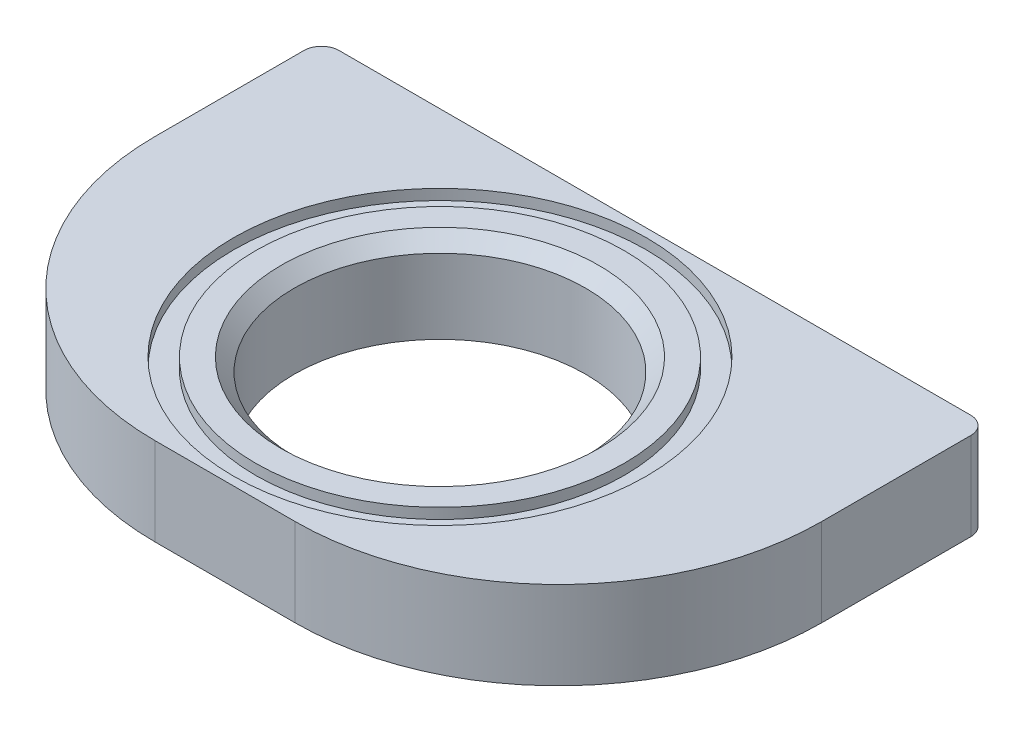
ISO-10303-21;
HEADER;
FILE_DESCRIPTION(('STEP AP214'),'2;1');
FILE_NAME('part.step','',(''),(''),'','','');
FILE_SCHEMA(('AUTOMOTIVE_DESIGN { 1 0 10303 214 1 1 1 1 }'));
ENDSEC;
DATA;
#1=APPLICATION_CONTEXT('core data for automotive mechanical design processes');
#2=APPLICATION_PROTOCOL_DEFINITION('international standard','automotive_design',2000,#1);
#3=PRODUCT_CONTEXT('',#1,'mechanical');
#4=PRODUCT('Part','Part','',(#3));
#5=PRODUCT_RELATED_PRODUCT_CATEGORY('part','',(#4));
#6=PRODUCT_DEFINITION_FORMATION('','',#4);
#7=PRODUCT_DEFINITION_CONTEXT('part definition',#1,'design');
#8=PRODUCT_DEFINITION('design','',#6,#7);
#9=PRODUCT_DEFINITION_SHAPE('','',#8);
#10=(LENGTH_UNIT() NAMED_UNIT(*) SI_UNIT(.MILLI.,.METRE.));
#11=(NAMED_UNIT(*) PLANE_ANGLE_UNIT() SI_UNIT($,.RADIAN.));
#12=(NAMED_UNIT(*) SI_UNIT($,.STERADIAN.) SOLID_ANGLE_UNIT());
#13=UNCERTAINTY_MEASURE_WITH_UNIT(LENGTH_MEASURE(1.E-05),#10,'distance_accuracy_value','');
#14=(GEOMETRIC_REPRESENTATION_CONTEXT(3) GLOBAL_UNCERTAINTY_ASSIGNED_CONTEXT((#13)) GLOBAL_UNIT_ASSIGNED_CONTEXT((#10,
#11,#12)) REPRESENTATION_CONTEXT('',''));
#15=CARTESIAN_POINT('',(0.,0.,0.));
#16=DIRECTION('',(0.,0.,1.));
#17=DIRECTION('',(1.,0.,0.));
#18=AXIS2_PLACEMENT_3D('',#15,#16,#17);
#19=CARTESIAN_POINT('',(0.,5.,0.));
#20=DIRECTION('',(0.,1.,0.));
#21=DIRECTION('',(0.,0.,1.));
#22=AXIS2_PLACEMENT_3D('',#19,#20,#21);
#23=PLANE('',#22);
#24=CARTESIAN_POINT('',(0.,5.,0.));
#25=DIRECTION('',(0.,1.,0.));
#26=DIRECTION('',(0.,0.,1.));
#27=AXIS2_PLACEMENT_3D('',#24,#25,#26);
#28=CIRCLE('',#27,10.5);
#29=CARTESIAN_POINT('',(-10.5,5.,0.));
#30=VERTEX_POINT('',#29);
#31=EDGE_CURVE('E11',#30,#30,#28,.F.);
#32=ORIENTED_EDGE('',*,*,#31,.F.);
#33=EDGE_LOOP('',(#32));
#34=FACE_BOUND('',#33,.T.);
#35=CARTESIAN_POINT('',(0.,5.,0.));
#36=DIRECTION('',(0.,1.,0.));
#37=DIRECTION('',(0.,0.,1.));
#38=AXIS2_PLACEMENT_3D('',#35,#36,#37);
#39=CIRCLE('',#38,9.05000000000001);
#40=CARTESIAN_POINT('',(0.,5.,9.05000000000001));
#41=VERTEX_POINT('',#40);
#42=EDGE_CURVE('E195',#41,#41,#39,.F.);
#43=ORIENTED_EDGE('',*,*,#42,.T.);
#44=EDGE_LOOP('',(#43));
#45=FACE_BOUND('',#44,.T.);
#46=ADVANCED_FACE('F38',(#34,#45),#23,.T.);
#47=CARTESIAN_POINT('',(0.,5.,0.));
#48=DIRECTION('',(0.,1.,0.));
#49=DIRECTION('',(0.,0.,1.));
#50=AXIS2_PLACEMENT_3D('',#47,#48,#49);
#51=CIRCLE('',#50,11.7670948647706);
#52=CARTESIAN_POINT('',(-11.7670948647706,5.,0.));
#53=VERTEX_POINT('',#52);
#54=EDGE_CURVE('E47',#53,#53,#51,.T.);
#55=ORIENTED_EDGE('',*,*,#54,.F.);
#56=EDGE_LOOP('',(#55));
#57=FACE_BOUND('',#56,.T.);
#58=DIRECTION('',(-1.,0.,0.));
#59=VECTOR('',#58,1.);
#60=CARTESIAN_POINT('',(-19.,5.,-12.25));
#61=LINE('',#60,#59);
#62=CARTESIAN_POINT('',(18.,5.,-12.25));
#63=VERTEX_POINT('',#62);
#64=CARTESIAN_POINT('',(-18.,5.,-12.25));
#65=VERTEX_POINT('',#64);
#66=EDGE_CURVE('E142',#63,#65,#61,.T.);
#67=ORIENTED_EDGE('',*,*,#66,.T.);
#68=CARTESIAN_POINT('',(-18.,5.,-11.25));
#69=DIRECTION('',(0.,1.,0.));
#70=DIRECTION('',(0.,0.,1.));
#71=AXIS2_PLACEMENT_3D('',#68,#69,#70);
#72=CIRCLE('',#71,1.);
#73=CARTESIAN_POINT('',(-19.,5.,-11.25));
#74=VERTEX_POINT('',#73);
#75=EDGE_CURVE('E188',#65,#74,#72,.T.);
#76=ORIENTED_EDGE('',*,*,#75,.T.);
#77=DIRECTION('',(0.,0.,1.));
#78=VECTOR('',#77,1.);
#79=CARTESIAN_POINT('',(-19.,5.,-12.25));
#80=LINE('',#79,#78);
#81=CARTESIAN_POINT('',(-19.,5.,-2.75));
#82=VERTEX_POINT('',#81);
#83=EDGE_CURVE('E133',#74,#82,#80,.T.);
#84=ORIENTED_EDGE('',*,*,#83,.T.);
#85=CARTESIAN_POINT('',(-4.,5.,-2.75));
#86=DIRECTION('',(0.,1.,0.));
#87=DIRECTION('',(0.,0.,1.));
#88=AXIS2_PLACEMENT_3D('',#85,#86,#87);
#89=CIRCLE('',#88,15.);
#90=CARTESIAN_POINT('',(-4.,5.,12.25));
#91=VERTEX_POINT('',#90);
#92=EDGE_CURVE('E167',#82,#91,#89,.T.);
#93=ORIENTED_EDGE('',*,*,#92,.T.);
#94=DIRECTION('',(1.,0.,0.));
#95=VECTOR('',#94,1.);
#96=CARTESIAN_POINT('',(-19.,5.,12.25));
#97=LINE('',#96,#95);
#98=CARTESIAN_POINT('',(4.,5.,12.25));
#99=VERTEX_POINT('',#98);
#100=EDGE_CURVE('E135',#91,#99,#97,.T.);
#101=ORIENTED_EDGE('',*,*,#100,.T.);
#102=CARTESIAN_POINT('',(4.,5.,-2.75));
#103=DIRECTION('',(0.,1.,0.));
#104=DIRECTION('',(0.,0.,1.));
#105=AXIS2_PLACEMENT_3D('',#102,#103,#104);
#106=CIRCLE('',#105,15.);
#107=CARTESIAN_POINT('',(19.,5.,-2.75));
#108=VERTEX_POINT('',#107);
#109=EDGE_CURVE('E169',#99,#108,#106,.T.);
#110=ORIENTED_EDGE('',*,*,#109,.T.);
#111=DIRECTION('',(0.,0.,-1.));
#112=VECTOR('',#111,1.);
#113=CARTESIAN_POINT('',(19.,5.,-12.25));
#114=LINE('',#113,#112);
#115=CARTESIAN_POINT('',(19.,5.,-11.25));
#116=VERTEX_POINT('',#115);
#117=EDGE_CURVE('E139',#108,#116,#114,.T.);
#118=ORIENTED_EDGE('',*,*,#117,.T.);
#119=CARTESIAN_POINT('',(18.,5.,-11.25));
#120=DIRECTION('',(0.,1.,0.));
#121=DIRECTION('',(0.,0.,1.));
#122=AXIS2_PLACEMENT_3D('',#119,#120,#121);
#123=CIRCLE('',#122,1.);
#124=EDGE_CURVE('E186',#116,#63,#123,.T.);
#125=ORIENTED_EDGE('',*,*,#124,.T.);
#126=EDGE_LOOP('',(#67,#76,#84,#93,#101,#110,#118,#125));
#127=FACE_BOUND('',#126,.T.);
#128=ADVANCED_FACE('F217',(#57,#127),#23,.T.);
#129=CARTESIAN_POINT('',(0.,0.,0.));
#130=DIRECTION('',(0.,1.,0.));
#131=DIRECTION('',(0.,0.,1.));
#132=AXIS2_PLACEMENT_3D('',#129,#130,#131);
#133=PLANE('',#132);
#134=DIRECTION('',(0.,0.,1.));
#135=VECTOR('',#134,1.);
#136=CARTESIAN_POINT('',(-19.,0.,-12.25));
#137=LINE('',#136,#135);
#138=CARTESIAN_POINT('',(-19.,0.,-11.25));
#139=VERTEX_POINT('',#138);
#140=CARTESIAN_POINT('',(-19.,0.,-2.75));
#141=VERTEX_POINT('',#140);
#142=EDGE_CURVE('E132',#139,#141,#137,.T.);
#143=ORIENTED_EDGE('',*,*,#142,.F.);
#144=CARTESIAN_POINT('',(-18.,0.,-11.25));
#145=DIRECTION('',(0.,1.,0.));
#146=DIRECTION('',(0.,0.,1.));
#147=AXIS2_PLACEMENT_3D('',#144,#145,#146);
#148=CIRCLE('',#147,1.);
#149=CARTESIAN_POINT('',(-18.,0.,-12.25));
#150=VERTEX_POINT('',#149);
#151=EDGE_CURVE('E179',#139,#150,#148,.F.);
#152=ORIENTED_EDGE('',*,*,#151,.T.);
#153=DIRECTION('',(-1.,0.,0.));
#154=VECTOR('',#153,1.);
#155=CARTESIAN_POINT('',(-19.,0.,-12.25));
#156=LINE('',#155,#154);
#157=CARTESIAN_POINT('',(18.,0.,-12.25));
#158=VERTEX_POINT('',#157);
#159=EDGE_CURVE('E136',#158,#150,#156,.T.);
#160=ORIENTED_EDGE('',*,*,#159,.F.);
#161=CARTESIAN_POINT('',(18.,0.,-11.25));
#162=DIRECTION('',(0.,1.,0.));
#163=DIRECTION('',(0.,0.,1.));
#164=AXIS2_PLACEMENT_3D('',#161,#162,#163);
#165=CIRCLE('',#164,1.);
#166=CARTESIAN_POINT('',(19.,0.,-11.25));
#167=VERTEX_POINT('',#166);
#168=EDGE_CURVE('E177',#158,#167,#165,.F.);
#169=ORIENTED_EDGE('',*,*,#168,.T.);
#170=DIRECTION('',(0.,0.,-1.));
#171=VECTOR('',#170,1.);
#172=CARTESIAN_POINT('',(19.,0.,-12.25));
#173=LINE('',#172,#171);
#174=CARTESIAN_POINT('',(19.,0.,-2.75));
#175=VERTEX_POINT('',#174);
#176=EDGE_CURVE('E150',#175,#167,#173,.T.);
#177=ORIENTED_EDGE('',*,*,#176,.F.);
#178=CARTESIAN_POINT('',(4.,0.,-2.75));
#179=DIRECTION('',(0.,1.,0.));
#180=DIRECTION('',(0.,0.,1.));
#181=AXIS2_PLACEMENT_3D('',#178,#179,#180);
#182=CIRCLE('',#181,15.);
#183=CARTESIAN_POINT('',(4.,0.,12.25));
#184=VERTEX_POINT('',#183);
#185=EDGE_CURVE('E160',#175,#184,#182,.F.);
#186=ORIENTED_EDGE('',*,*,#185,.T.);
#187=DIRECTION('',(1.,0.,0.));
#188=VECTOR('',#187,1.);
#189=CARTESIAN_POINT('',(-19.,0.,12.25));
#190=LINE('',#189,#188);
#191=CARTESIAN_POINT('',(-4.,0.,12.25));
#192=VERTEX_POINT('',#191);
#193=EDGE_CURVE('E147',#192,#184,#190,.T.);
#194=ORIENTED_EDGE('',*,*,#193,.F.);
#195=CARTESIAN_POINT('',(-4.,0.,-2.75));
#196=DIRECTION('',(0.,1.,0.));
#197=DIRECTION('',(0.,0.,1.));
#198=AXIS2_PLACEMENT_3D('',#195,#196,#197);
#199=CIRCLE('',#198,15.);
#200=EDGE_CURVE('E157',#192,#141,#199,.F.);
#201=ORIENTED_EDGE('',*,*,#200,.T.);
#202=EDGE_LOOP('',(#143,#152,#160,#169,#177,#186,#194,#201));
#203=FACE_BOUND('',#202,.T.);
#204=CARTESIAN_POINT('',(0.,0.,0.));
#205=DIRECTION('',(0.,1.,0.));
#206=DIRECTION('',(0.,0.,1.));
#207=AXIS2_PLACEMENT_3D('',#204,#205,#206);
#208=CIRCLE('',#207,8.3);
#209=CARTESIAN_POINT('',(0.,0.,8.3));
#210=VERTEX_POINT('',#209);
#211=EDGE_CURVE('E125',#210,#210,#208,.T.);
#212=ORIENTED_EDGE('',*,*,#211,.T.);
#213=EDGE_LOOP('',(#212));
#214=FACE_BOUND('',#213,.T.);
#215=ADVANCED_FACE('F214',(#203,#214),#133,.F.);
#216=CARTESIAN_POINT('',(-19.,5.,-12.25));
#217=DIRECTION('',(1.,0.,0.));
#218=DIRECTION('',(0.,0.,-1.));
#219=AXIS2_PLACEMENT_3D('',#216,#217,#218);
#220=PLANE('',#219);
#221=ORIENTED_EDGE('',*,*,#83,.F.);
#222=DIRECTION('',(0.,-1.,0.));
#223=VECTOR('',#222,1.);
#224=CARTESIAN_POINT('',(-19.,5.,-11.25));
#225=LINE('',#224,#223);
#226=EDGE_CURVE('E174',#74,#139,#225,.T.);
#227=ORIENTED_EDGE('',*,*,#226,.T.);
#228=ORIENTED_EDGE('',*,*,#142,.T.);
#229=DIRECTION('',(0.,-1.,0.));
#230=VECTOR('',#229,1.);
#231=CARTESIAN_POINT('',(-19.,5.,-2.75));
#232=LINE('',#231,#230);
#233=EDGE_CURVE('E171',#141,#82,#232,.F.);
#234=ORIENTED_EDGE('',*,*,#233,.T.);
#235=EDGE_LOOP('',(#221,#227,#228,#234));
#236=FACE_BOUND('',#235,.T.);
#237=ADVANCED_FACE('F216',(#236),#220,.F.);
#238=CARTESIAN_POINT('',(-19.,5.,12.25));
#239=DIRECTION('',(0.,0.,-1.));
#240=DIRECTION('',(-1.,0.,0.));
#241=AXIS2_PLACEMENT_3D('',#238,#239,#240);
#242=PLANE('',#241);
#243=ORIENTED_EDGE('',*,*,#193,.T.);
#244=DIRECTION('',(0.,-1.,0.));
#245=VECTOR('',#244,1.);
#246=CARTESIAN_POINT('',(4.,5.,12.25));
#247=LINE('',#246,#245);
#248=EDGE_CURVE('E165',#184,#99,#247,.F.);
#249=ORIENTED_EDGE('',*,*,#248,.T.);
#250=ORIENTED_EDGE('',*,*,#100,.F.);
#251=DIRECTION('',(0.,-1.,0.));
#252=VECTOR('',#251,1.);
#253=CARTESIAN_POINT('',(-4.,5.,12.25));
#254=LINE('',#253,#252);
#255=EDGE_CURVE('E162',#91,#192,#254,.T.);
#256=ORIENTED_EDGE('',*,*,#255,.T.);
#257=EDGE_LOOP('',(#243,#249,#250,#256));
#258=FACE_BOUND('',#257,.T.);
#259=ADVANCED_FACE('F224',(#258),#242,.F.);
#260=CARTESIAN_POINT('',(19.,5.,-12.25));
#261=DIRECTION('',(-1.,0.,0.));
#262=DIRECTION('',(0.,0.,1.));
#263=AXIS2_PLACEMENT_3D('',#260,#261,#262);
#264=PLANE('',#263);
#265=ORIENTED_EDGE('',*,*,#176,.T.);
#266=DIRECTION('',(0.,-1.,0.));
#267=VECTOR('',#266,1.);
#268=CARTESIAN_POINT('',(19.,5.,-11.25));
#269=LINE('',#268,#267);
#270=EDGE_CURVE('E190',#167,#116,#269,.F.);
#271=ORIENTED_EDGE('',*,*,#270,.T.);
#272=ORIENTED_EDGE('',*,*,#117,.F.);
#273=DIRECTION('',(0.,-1.,0.));
#274=VECTOR('',#273,1.);
#275=CARTESIAN_POINT('',(19.,5.,-2.75));
#276=LINE('',#275,#274);
#277=EDGE_CURVE('E145',#108,#175,#276,.T.);
#278=ORIENTED_EDGE('',*,*,#277,.T.);
#279=EDGE_LOOP('',(#265,#271,#272,#278));
#280=FACE_BOUND('',#279,.T.);
#281=ADVANCED_FACE('F297',(#280),#264,.F.);
#282=CARTESIAN_POINT('',(-19.,5.,-12.25));
#283=DIRECTION('',(0.,0.,1.));
#284=DIRECTION('',(1.,0.,0.));
#285=AXIS2_PLACEMENT_3D('',#282,#283,#284);
#286=PLANE('',#285);
#287=ORIENTED_EDGE('',*,*,#159,.T.);
#288=DIRECTION('',(0.,-1.,0.));
#289=VECTOR('',#288,1.);
#290=CARTESIAN_POINT('',(-18.,5.,-12.25));
#291=LINE('',#290,#289);
#292=EDGE_CURVE('E184',#150,#65,#291,.F.);
#293=ORIENTED_EDGE('',*,*,#292,.T.);
#294=ORIENTED_EDGE('',*,*,#66,.F.);
#295=DIRECTION('',(0.,-1.,0.));
#296=VECTOR('',#295,1.);
#297=CARTESIAN_POINT('',(18.,5.,-12.25));
#298=LINE('',#297,#296);
#299=EDGE_CURVE('E181',#63,#158,#298,.T.);
#300=ORIENTED_EDGE('',*,*,#299,.T.);
#301=EDGE_LOOP('',(#287,#293,#294,#300));
#302=FACE_BOUND('',#301,.T.);
#303=ADVANCED_FACE('F210',(#302),#286,.F.);
#304=CARTESIAN_POINT('',(0.,5.,0.));
#305=DIRECTION('',(0.,-1.,0.));
#306=DIRECTION('',(0.,0.,-1.));
#307=AXIS2_PLACEMENT_3D('',#304,#305,#306);
#308=CYLINDRICAL_SURFACE('',#307,8.3);
#309=CARTESIAN_POINT('',(0.,4.25,0.));
#310=DIRECTION('',(0.,1.,0.));
#311=DIRECTION('',(0.,0.,1.));
#312=AXIS2_PLACEMENT_3D('',#309,#310,#311);
#313=CIRCLE('',#312,8.3);
#314=CARTESIAN_POINT('',(0.,4.25,8.3));
#315=VERTEX_POINT('',#314);
#316=EDGE_CURVE('E192',#315,#315,#313,.T.);
#317=ORIENTED_EDGE('',*,*,#316,.T.);
#318=EDGE_LOOP('',(#317));
#319=FACE_BOUND('',#318,.T.);
#320=ORIENTED_EDGE('',*,*,#211,.F.);
#321=EDGE_LOOP('',(#320));
#322=FACE_BOUND('',#321,.T.);
#323=ADVANCED_FACE('F206',(#319,#322),#308,.F.);
#324=CARTESIAN_POINT('',(4.,5.,-2.75));
#325=DIRECTION('',(0.,-1.,0.));
#326=DIRECTION('',(0.,0.,-1.));
#327=AXIS2_PLACEMENT_3D('',#324,#325,#326);
#328=CYLINDRICAL_SURFACE('',#327,15.);
#329=ORIENTED_EDGE('',*,*,#109,.F.);
#330=ORIENTED_EDGE('',*,*,#248,.F.);
#331=ORIENTED_EDGE('',*,*,#185,.F.);
#332=ORIENTED_EDGE('',*,*,#277,.F.);
#333=EDGE_LOOP('',(#329,#330,#331,#332));
#334=FACE_BOUND('',#333,.T.);
#335=ADVANCED_FACE('F209',(#334),#328,.T.);
#336=CARTESIAN_POINT('',(-4.,5.,-2.75));
#337=DIRECTION('',(0.,-1.,0.));
#338=DIRECTION('',(0.,0.,-1.));
#339=AXIS2_PLACEMENT_3D('',#336,#337,#338);
#340=CYLINDRICAL_SURFACE('',#339,15.);
#341=ORIENTED_EDGE('',*,*,#92,.F.);
#342=ORIENTED_EDGE('',*,*,#233,.F.);
#343=ORIENTED_EDGE('',*,*,#200,.F.);
#344=ORIENTED_EDGE('',*,*,#255,.F.);
#345=EDGE_LOOP('',(#341,#342,#343,#344));
#346=FACE_BOUND('',#345,.T.);
#347=ADVANCED_FACE('F271',(#346),#340,.T.);
#348=CARTESIAN_POINT('',(-18.,5.,-11.25));
#349=DIRECTION('',(0.,-1.,0.));
#350=DIRECTION('',(0.,0.,-1.));
#351=AXIS2_PLACEMENT_3D('',#348,#349,#350);
#352=CYLINDRICAL_SURFACE('',#351,1.);
#353=ORIENTED_EDGE('',*,*,#75,.F.);
#354=ORIENTED_EDGE('',*,*,#292,.F.);
#355=ORIENTED_EDGE('',*,*,#151,.F.);
#356=ORIENTED_EDGE('',*,*,#226,.F.);
#357=EDGE_LOOP('',(#353,#354,#355,#356));
#358=FACE_BOUND('',#357,.T.);
#359=ADVANCED_FACE('F264',(#358),#352,.T.);
#360=CARTESIAN_POINT('',(18.,5.,-11.25));
#361=DIRECTION('',(0.,-1.,0.));
#362=DIRECTION('',(0.,0.,-1.));
#363=AXIS2_PLACEMENT_3D('',#360,#361,#362);
#364=CYLINDRICAL_SURFACE('',#363,1.);
#365=ORIENTED_EDGE('',*,*,#124,.F.);
#366=ORIENTED_EDGE('',*,*,#270,.F.);
#367=ORIENTED_EDGE('',*,*,#168,.F.);
#368=ORIENTED_EDGE('',*,*,#299,.F.);
#369=EDGE_LOOP('',(#365,#366,#367,#368));
#370=FACE_BOUND('',#369,.T.);
#371=ADVANCED_FACE('F203',(#370),#364,.T.);
#372=CARTESIAN_POINT('',(0.,4.25,0.));
#373=DIRECTION('',(0.,1.,0.));
#374=DIRECTION('',(0.,0.,1.));
#375=AXIS2_PLACEMENT_3D('',#372,#373,#374);
#376=CONICAL_SURFACE('',#375,8.3,0.785398163397452);
#377=ORIENTED_EDGE('',*,*,#42,.F.);
#378=EDGE_LOOP('',(#377));
#379=FACE_BOUND('',#378,.T.);
#380=ORIENTED_EDGE('',*,*,#316,.F.);
#381=EDGE_LOOP('',(#380));
#382=FACE_BOUND('',#381,.T.);
#383=ADVANCED_FACE('F41',(#379,#382),#376,.F.);
#384=CARTESIAN_POINT('',(0.,5.,0.));
#385=DIRECTION('',(0.,1.,0.));
#386=DIRECTION('',(0.,0.,1.));
#387=AXIS2_PLACEMENT_3D('',#384,#385,#386);
#388=CYLINDRICAL_SURFACE('',#387,10.5);
#389=ORIENTED_EDGE('',*,*,#31,.T.);
#390=DIRECTION('',(0.,1.,0.));
#391=VECTOR('',#390,1.);
#392=CARTESIAN_POINT('',(-10.5,5.55125944910233,0.));
#393=LINE('',#392,#391);
#394=CARTESIAN_POINT('',(-10.5,4.4,0.));
#395=VERTEX_POINT('',#394);
#396=EDGE_CURVE('E53',#395,#30,#393,.T.);
#397=ORIENTED_EDGE('',*,*,#396,.F.);
#398=CARTESIAN_POINT('',(0.,4.4,0.));
#399=DIRECTION('',(0.,1.,0.));
#400=DIRECTION('',(-1.,0.,0.));
#401=AXIS2_PLACEMENT_3D('',#398,#399,#400);
#402=CIRCLE('',#401,10.5);
#403=EDGE_CURVE('E123',#395,#395,#402,.T.);
#404=ORIENTED_EDGE('',*,*,#403,.T.);
#405=ORIENTED_EDGE('',*,*,#396,.T.);
#406=EDGE_LOOP('',(#389,#397,#404,#405));
#407=FACE_BOUND('',#406,.T.);
#408=ADVANCED_FACE('F202',(#407),#388,.T.);
#409=CARTESIAN_POINT('',(-10.5,4.4,0.));
#410=DIRECTION('',(0.,-1.,0.));
#411=DIRECTION('',(0.,0.,-1.));
#412=AXIS2_PLACEMENT_3D('',#409,#410,#411);
#413=PLANE('',#412);
#414=CARTESIAN_POINT('',(0.,4.4,0.));
#415=DIRECTION('',(0.,1.,0.));
#416=DIRECTION('',(-1.,0.,0.));
#417=AXIS2_PLACEMENT_3D('',#414,#415,#416);
#418=CIRCLE('',#417,11.7670948647706);
#419=CARTESIAN_POINT('',(-11.7670948647706,4.4,0.));
#420=VERTEX_POINT('',#419);
#421=EDGE_CURVE('E114',#420,#420,#418,.T.);
#422=ORIENTED_EDGE('',*,*,#421,.T.);
#423=EDGE_LOOP('',(#422));
#424=FACE_BOUND('',#423,.T.);
#425=ORIENTED_EDGE('',*,*,#403,.F.);
#426=EDGE_LOOP('',(#425));
#427=FACE_BOUND('',#426,.T.);
#428=ADVANCED_FACE('F121',(#424,#427),#413,.F.);
#429=CARTESIAN_POINT('',(0.,5.,0.));
#430=DIRECTION('',(0.,1.,0.));
#431=DIRECTION('',(0.,0.,1.));
#432=AXIS2_PLACEMENT_3D('',#429,#430,#431);
#433=CYLINDRICAL_SURFACE('',#432,11.7670948647706);
#434=ORIENTED_EDGE('',*,*,#54,.T.);
#435=DIRECTION('',(0.,-1.,0.));
#436=VECTOR('',#435,1.);
#437=CARTESIAN_POINT('',(-11.7670948647706,5.55125944910233,0.));
#438=LINE('',#437,#436);
#439=EDGE_CURVE('E60',#53,#420,#438,.T.);
#440=ORIENTED_EDGE('',*,*,#439,.T.);
#441=ORIENTED_EDGE('',*,*,#421,.F.);
#442=ORIENTED_EDGE('',*,*,#439,.F.);
#443=EDGE_LOOP('',(#434,#440,#441,#442));
#444=FACE_BOUND('',#443,.T.);
#445=ADVANCED_FACE('F113',(#444),#433,.F.);
#446=CLOSED_SHELL('',(#46,#128,#215,#237,#259,#281,#303,#323,#335,#347,#359,#371,#383,#408,#428,#445));
#447=MANIFOLD_SOLID_BREP('B2',#446);
#448=ADVANCED_BREP_SHAPE_REPRESENTATION('',(#18,#447),#14);
#449=SHAPE_DEFINITION_REPRESENTATION(#9,#448);
ENDSEC;
END-ISO-10303-21;
